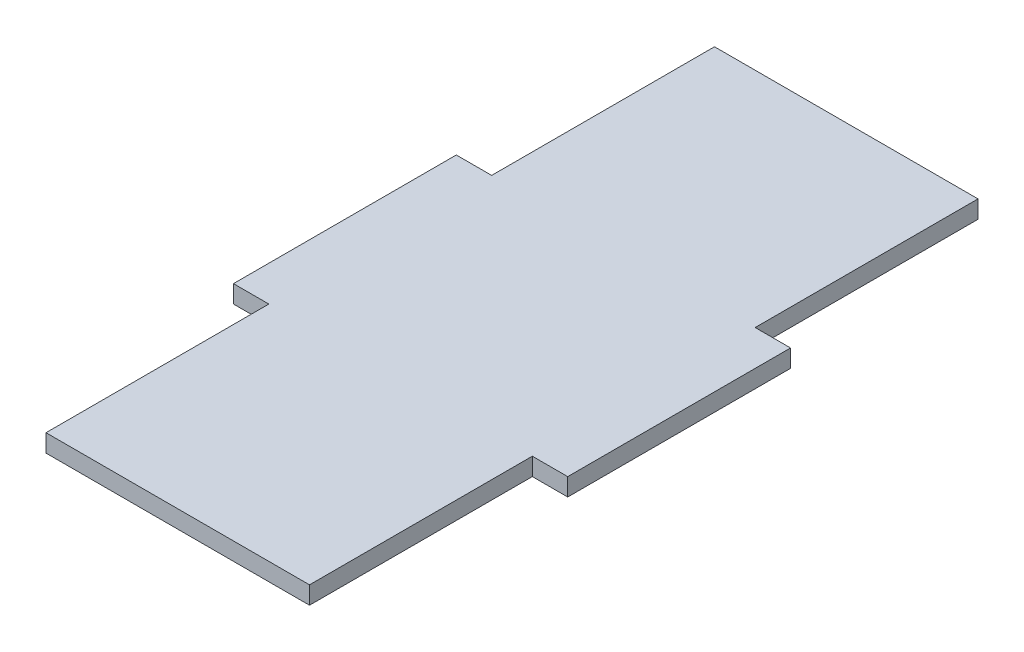
ISO-10303-21;
HEADER;
FILE_DESCRIPTION(('STEP AP214'),'2;1');
FILE_NAME('part.step','',(''),(''),'','','');
FILE_SCHEMA(('AUTOMOTIVE_DESIGN { 1 0 10303 214 1 1 1 1 }'));
ENDSEC;
DATA;
#1=APPLICATION_CONTEXT('core data for automotive mechanical design processes');
#2=APPLICATION_PROTOCOL_DEFINITION('international standard','automotive_design',2000,#1);
#3=PRODUCT_CONTEXT('',#1,'mechanical');
#4=PRODUCT('Part','Part','',(#3));
#5=PRODUCT_RELATED_PRODUCT_CATEGORY('part','',(#4));
#6=PRODUCT_DEFINITION_FORMATION('','',#4);
#7=PRODUCT_DEFINITION_CONTEXT('part definition',#1,'design');
#8=PRODUCT_DEFINITION('design','',#6,#7);
#9=PRODUCT_DEFINITION_SHAPE('','',#8);
#10=(LENGTH_UNIT() NAMED_UNIT(*) SI_UNIT(.MILLI.,.METRE.));
#11=(NAMED_UNIT(*) PLANE_ANGLE_UNIT() SI_UNIT($,.RADIAN.));
#12=(NAMED_UNIT(*) SI_UNIT($,.STERADIAN.) SOLID_ANGLE_UNIT());
#13=UNCERTAINTY_MEASURE_WITH_UNIT(LENGTH_MEASURE(1.E-05),#10,'distance_accuracy_value','');
#14=(GEOMETRIC_REPRESENTATION_CONTEXT(3) GLOBAL_UNCERTAINTY_ASSIGNED_CONTEXT((#13)) GLOBAL_UNIT_ASSIGNED_CONTEXT((#10,
#11,#12)) REPRESENTATION_CONTEXT('',''));
#15=CARTESIAN_POINT('',(0.,0.,0.));
#16=DIRECTION('',(0.,0.,1.));
#17=DIRECTION('',(1.,0.,0.));
#18=AXIS2_PLACEMENT_3D('',#15,#16,#17);
#19=CARTESIAN_POINT('',(30.,3.175,0.));
#20=DIRECTION('',(1.,0.,0.));
#21=DIRECTION('',(0.,0.,-1.));
#22=AXIS2_PLACEMENT_3D('',#19,#20,#21);
#23=PLANE('',#22);
#24=DIRECTION('',(0.,0.,1.));
#25=VECTOR('',#24,1.);
#26=CARTESIAN_POINT('',(30.,0.,0.));
#27=LINE('',#26,#25);
#28=CARTESIAN_POINT('',(30.,0.,-20.));
#29=VERTEX_POINT('',#28);
#30=CARTESIAN_POINT('',(30.,0.,20.));
#31=VERTEX_POINT('',#30);
#32=EDGE_CURVE('E156',#29,#31,#27,.T.);
#33=ORIENTED_EDGE('',*,*,#32,.F.);
#34=DIRECTION('',(0.,-1.,0.));
#35=VECTOR('',#34,1.);
#36=CARTESIAN_POINT('',(30.,3.175,-20.));
#37=LINE('',#36,#35);
#38=CARTESIAN_POINT('',(30.,3.175,-20.));
#39=VERTEX_POINT('',#38);
#40=EDGE_CURVE('E11',#39,#29,#37,.T.);
#41=ORIENTED_EDGE('',*,*,#40,.F.);
#42=DIRECTION('',(0.,0.,1.));
#43=VECTOR('',#42,1.);
#44=CARTESIAN_POINT('',(30.,3.175,0.));
#45=LINE('',#44,#43);
#46=CARTESIAN_POINT('',(30.,3.175,20.));
#47=VERTEX_POINT('',#46);
#48=EDGE_CURVE('E187',#39,#47,#45,.T.);
#49=ORIENTED_EDGE('',*,*,#48,.T.);
#50=DIRECTION('',(0.,-1.,0.));
#51=VECTOR('',#50,1.);
#52=CARTESIAN_POINT('',(30.,3.175,20.));
#53=LINE('',#52,#51);
#54=EDGE_CURVE('E55',#47,#31,#53,.T.);
#55=ORIENTED_EDGE('',*,*,#54,.T.);
#56=EDGE_LOOP('',(#33,#41,#49,#55));
#57=FACE_BOUND('',#56,.T.);
#58=ADVANCED_FACE('F39',(#57),#23,.T.);
#59=CARTESIAN_POINT('',(0.,3.175,-20.));
#60=DIRECTION('',(0.,0.,1.));
#61=DIRECTION('',(1.,0.,0.));
#62=AXIS2_PLACEMENT_3D('',#59,#60,#61);
#63=PLANE('',#62);
#64=DIRECTION('',(-1.,0.,0.));
#65=VECTOR('',#64,1.);
#66=CARTESIAN_POINT('',(0.,0.,-20.));
#67=LINE('',#66,#65);
#68=CARTESIAN_POINT('',(23.65,0.,-20.));
#69=VERTEX_POINT('',#68);
#70=EDGE_CURVE('E158',#29,#69,#67,.T.);
#71=ORIENTED_EDGE('',*,*,#70,.T.);
#72=DIRECTION('',(0.,-1.,0.));
#73=VECTOR('',#72,1.);
#74=CARTESIAN_POINT('',(23.65,3.175,-20.));
#75=LINE('',#74,#73);
#76=CARTESIAN_POINT('',(23.65,3.175,-20.));
#77=VERTEX_POINT('',#76);
#78=EDGE_CURVE('E47',#77,#69,#75,.T.);
#79=ORIENTED_EDGE('',*,*,#78,.F.);
#80=DIRECTION('',(-1.,0.,0.));
#81=VECTOR('',#80,1.);
#82=CARTESIAN_POINT('',(0.,3.175,-20.));
#83=LINE('',#82,#81);
#84=EDGE_CURVE('E223',#39,#77,#83,.T.);
#85=ORIENTED_EDGE('',*,*,#84,.F.);
#86=ORIENTED_EDGE('',*,*,#40,.T.);
#87=EDGE_LOOP('',(#71,#79,#85,#86));
#88=FACE_BOUND('',#87,.T.);
#89=ADVANCED_FACE('F212',(#88),#63,.F.);
#90=CARTESIAN_POINT('',(23.65,3.175,0.));
#91=DIRECTION('',(1.,0.,0.));
#92=DIRECTION('',(0.,0.,-1.));
#93=AXIS2_PLACEMENT_3D('',#90,#91,#92);
#94=PLANE('',#93);
#95=DIRECTION('',(0.,0.,1.));
#96=VECTOR('',#95,1.);
#97=CARTESIAN_POINT('',(23.65,0.,0.));
#98=LINE('',#97,#96);
#99=CARTESIAN_POINT('',(23.65,0.,-60.));
#100=VERTEX_POINT('',#99);
#101=EDGE_CURVE('E161',#100,#69,#98,.T.);
#102=ORIENTED_EDGE('',*,*,#101,.F.);
#103=DIRECTION('',(0.,-1.,0.));
#104=VECTOR('',#103,1.);
#105=CARTESIAN_POINT('',(23.65,3.175,-60.));
#106=LINE('',#105,#104);
#107=CARTESIAN_POINT('',(23.65,3.175,-60.));
#108=VERTEX_POINT('',#107);
#109=EDGE_CURVE('E202',#108,#100,#106,.T.);
#110=ORIENTED_EDGE('',*,*,#109,.F.);
#111=DIRECTION('',(0.,0.,1.));
#112=VECTOR('',#111,1.);
#113=CARTESIAN_POINT('',(23.65,3.175,0.));
#114=LINE('',#113,#112);
#115=EDGE_CURVE('E209',#108,#77,#114,.T.);
#116=ORIENTED_EDGE('',*,*,#115,.T.);
#117=ORIENTED_EDGE('',*,*,#78,.T.);
#118=EDGE_LOOP('',(#102,#110,#116,#117));
#119=FACE_BOUND('',#118,.T.);
#120=ADVANCED_FACE('F207',(#119),#94,.T.);
#121=CARTESIAN_POINT('',(0.,3.175,-60.));
#122=DIRECTION('',(0.,0.,-1.));
#123=DIRECTION('',(-1.,0.,0.));
#124=AXIS2_PLACEMENT_3D('',#121,#122,#123);
#125=PLANE('',#124);
#126=DIRECTION('',(1.,0.,0.));
#127=VECTOR('',#126,1.);
#128=CARTESIAN_POINT('',(0.,0.,-60.));
#129=LINE('',#128,#127);
#130=CARTESIAN_POINT('',(-23.65,0.,-60.));
#131=VERTEX_POINT('',#130);
#132=EDGE_CURVE('E164',#131,#100,#129,.T.);
#133=ORIENTED_EDGE('',*,*,#132,.F.);
#134=DIRECTION('',(0.,-1.,0.));
#135=VECTOR('',#134,1.);
#136=CARTESIAN_POINT('',(-23.65,3.175,-60.));
#137=LINE('',#136,#135);
#138=CARTESIAN_POINT('',(-23.65,3.175,-60.));
#139=VERTEX_POINT('',#138);
#140=EDGE_CURVE('E200',#139,#131,#137,.T.);
#141=ORIENTED_EDGE('',*,*,#140,.F.);
#142=DIRECTION('',(1.,0.,0.));
#143=VECTOR('',#142,1.);
#144=CARTESIAN_POINT('',(0.,3.175,-60.));
#145=LINE('',#144,#143);
#146=EDGE_CURVE('E222',#139,#108,#145,.T.);
#147=ORIENTED_EDGE('',*,*,#146,.T.);
#148=ORIENTED_EDGE('',*,*,#109,.T.);
#149=EDGE_LOOP('',(#133,#141,#147,#148));
#150=FACE_BOUND('',#149,.T.);
#151=ADVANCED_FACE('F218',(#150),#125,.T.);
#152=CARTESIAN_POINT('',(-23.65,3.175,0.));
#153=DIRECTION('',(1.,0.,0.));
#154=DIRECTION('',(0.,0.,-1.));
#155=AXIS2_PLACEMENT_3D('',#152,#153,#154);
#156=PLANE('',#155);
#157=DIRECTION('',(0.,0.,1.));
#158=VECTOR('',#157,1.);
#159=CARTESIAN_POINT('',(-23.65,0.,0.));
#160=LINE('',#159,#158);
#161=CARTESIAN_POINT('',(-23.65,0.,-20.));
#162=VERTEX_POINT('',#161);
#163=EDGE_CURVE('E167',#131,#162,#160,.T.);
#164=ORIENTED_EDGE('',*,*,#163,.T.);
#165=DIRECTION('',(0.,-1.,0.));
#166=VECTOR('',#165,1.);
#167=CARTESIAN_POINT('',(-23.65,3.175,-20.));
#168=LINE('',#167,#166);
#169=CARTESIAN_POINT('',(-23.65,3.175,-20.));
#170=VERTEX_POINT('',#169);
#171=EDGE_CURVE('E198',#170,#162,#168,.T.);
#172=ORIENTED_EDGE('',*,*,#171,.F.);
#173=DIRECTION('',(0.,0.,1.));
#174=VECTOR('',#173,1.);
#175=CARTESIAN_POINT('',(-23.65,3.175,0.));
#176=LINE('',#175,#174);
#177=EDGE_CURVE('E225',#139,#170,#176,.T.);
#178=ORIENTED_EDGE('',*,*,#177,.F.);
#179=ORIENTED_EDGE('',*,*,#140,.T.);
#180=EDGE_LOOP('',(#164,#172,#178,#179));
#181=FACE_BOUND('',#180,.T.);
#182=ADVANCED_FACE('F263',(#181),#156,.F.);
#183=CARTESIAN_POINT('',(0.,3.175,-20.));
#184=DIRECTION('',(0.,0.,-1.));
#185=DIRECTION('',(-1.,0.,0.));
#186=AXIS2_PLACEMENT_3D('',#183,#184,#185);
#187=PLANE('',#186);
#188=DIRECTION('',(1.,0.,0.));
#189=VECTOR('',#188,1.);
#190=CARTESIAN_POINT('',(0.,0.,-20.));
#191=LINE('',#190,#189);
#192=CARTESIAN_POINT('',(-30.,0.,-20.));
#193=VERTEX_POINT('',#192);
#194=EDGE_CURVE('E170',#193,#162,#191,.T.);
#195=ORIENTED_EDGE('',*,*,#194,.F.);
#196=DIRECTION('',(0.,-1.,0.));
#197=VECTOR('',#196,1.);
#198=CARTESIAN_POINT('',(-30.,3.175,-20.));
#199=LINE('',#198,#197);
#200=CARTESIAN_POINT('',(-30.,3.175,-20.));
#201=VERTEX_POINT('',#200);
#202=EDGE_CURVE('E196',#201,#193,#199,.T.);
#203=ORIENTED_EDGE('',*,*,#202,.F.);
#204=DIRECTION('',(1.,0.,0.));
#205=VECTOR('',#204,1.);
#206=CARTESIAN_POINT('',(0.,3.175,-20.));
#207=LINE('',#206,#205);
#208=EDGE_CURVE('E231',#201,#170,#207,.T.);
#209=ORIENTED_EDGE('',*,*,#208,.T.);
#210=ORIENTED_EDGE('',*,*,#171,.T.);
#211=EDGE_LOOP('',(#195,#203,#209,#210));
#212=FACE_BOUND('',#211,.T.);
#213=ADVANCED_FACE('F266',(#212),#187,.T.);
#214=CARTESIAN_POINT('',(-30.,3.175,0.));
#215=DIRECTION('',(1.,0.,0.));
#216=DIRECTION('',(0.,0.,-1.));
#217=AXIS2_PLACEMENT_3D('',#214,#215,#216);
#218=PLANE('',#217);
#219=DIRECTION('',(0.,0.,1.));
#220=VECTOR('',#219,1.);
#221=CARTESIAN_POINT('',(-30.,0.,0.));
#222=LINE('',#221,#220);
#223=CARTESIAN_POINT('',(-30.,0.,20.));
#224=VERTEX_POINT('',#223);
#225=EDGE_CURVE('E173',#193,#224,#222,.T.);
#226=ORIENTED_EDGE('',*,*,#225,.T.);
#227=DIRECTION('',(0.,-1.,0.));
#228=VECTOR('',#227,1.);
#229=CARTESIAN_POINT('',(-30.,3.175,20.));
#230=LINE('',#229,#228);
#231=CARTESIAN_POINT('',(-30.,3.175,20.));
#232=VERTEX_POINT('',#231);
#233=EDGE_CURVE('E193',#232,#224,#230,.T.);
#234=ORIENTED_EDGE('',*,*,#233,.F.);
#235=DIRECTION('',(0.,0.,1.));
#236=VECTOR('',#235,1.);
#237=CARTESIAN_POINT('',(-30.,3.175,0.));
#238=LINE('',#237,#236);
#239=EDGE_CURVE('E234',#201,#232,#238,.T.);
#240=ORIENTED_EDGE('',*,*,#239,.F.);
#241=ORIENTED_EDGE('',*,*,#202,.T.);
#242=EDGE_LOOP('',(#226,#234,#240,#241));
#243=FACE_BOUND('',#242,.T.);
#244=ADVANCED_FACE('F270',(#243),#218,.F.);
#245=CARTESIAN_POINT('',(0.,3.175,20.));
#246=DIRECTION('',(0.,0.,-1.));
#247=DIRECTION('',(-1.,0.,0.));
#248=AXIS2_PLACEMENT_3D('',#245,#246,#247);
#249=PLANE('',#248);
#250=DIRECTION('',(1.,0.,0.));
#251=VECTOR('',#250,1.);
#252=CARTESIAN_POINT('',(0.,0.,20.));
#253=LINE('',#252,#251);
#254=CARTESIAN_POINT('',(-23.65,0.,20.));
#255=VERTEX_POINT('',#254);
#256=EDGE_CURVE('E175',#224,#255,#253,.T.);
#257=ORIENTED_EDGE('',*,*,#256,.T.);
#258=DIRECTION('',(0.,-1.,0.));
#259=VECTOR('',#258,1.);
#260=CARTESIAN_POINT('',(-23.65,3.175,20.));
#261=LINE('',#260,#259);
#262=CARTESIAN_POINT('',(-23.65,3.175,20.));
#263=VERTEX_POINT('',#262);
#264=EDGE_CURVE('E191',#263,#255,#261,.T.);
#265=ORIENTED_EDGE('',*,*,#264,.F.);
#266=DIRECTION('',(1.,0.,0.));
#267=VECTOR('',#266,1.);
#268=CARTESIAN_POINT('',(0.,3.175,20.));
#269=LINE('',#268,#267);
#270=EDGE_CURVE('E236',#232,#263,#269,.T.);
#271=ORIENTED_EDGE('',*,*,#270,.F.);
#272=ORIENTED_EDGE('',*,*,#233,.T.);
#273=EDGE_LOOP('',(#257,#265,#271,#272));
#274=FACE_BOUND('',#273,.T.);
#275=ADVANCED_FACE('F274',(#274),#249,.F.);
#276=CARTESIAN_POINT('',(-23.65,3.175,0.));
#277=DIRECTION('',(-1.,0.,0.));
#278=DIRECTION('',(0.,0.,1.));
#279=AXIS2_PLACEMENT_3D('',#276,#277,#278);
#280=PLANE('',#279);
#281=DIRECTION('',(0.,0.,-1.));
#282=VECTOR('',#281,1.);
#283=CARTESIAN_POINT('',(-23.65,0.,0.));
#284=LINE('',#283,#282);
#285=CARTESIAN_POINT('',(-23.65,0.,60.));
#286=VERTEX_POINT('',#285);
#287=EDGE_CURVE('E178',#286,#255,#284,.T.);
#288=ORIENTED_EDGE('',*,*,#287,.F.);
#289=DIRECTION('',(0.,-1.,0.));
#290=VECTOR('',#289,1.);
#291=CARTESIAN_POINT('',(-23.65,3.175,60.));
#292=LINE('',#291,#290);
#293=CARTESIAN_POINT('',(-23.65,3.175,60.));
#294=VERTEX_POINT('',#293);
#295=EDGE_CURVE('E148',#294,#286,#292,.T.);
#296=ORIENTED_EDGE('',*,*,#295,.F.);
#297=DIRECTION('',(0.,0.,-1.));
#298=VECTOR('',#297,1.);
#299=CARTESIAN_POINT('',(-23.65,3.175,0.));
#300=LINE('',#299,#298);
#301=EDGE_CURVE('E138',#294,#263,#300,.T.);
#302=ORIENTED_EDGE('',*,*,#301,.T.);
#303=ORIENTED_EDGE('',*,*,#264,.T.);
#304=EDGE_LOOP('',(#288,#296,#302,#303));
#305=FACE_BOUND('',#304,.T.);
#306=ADVANCED_FACE('F239',(#305),#280,.T.);
#307=CARTESIAN_POINT('',(0.,3.175,60.));
#308=DIRECTION('',(0.,0.,-1.));
#309=DIRECTION('',(-1.,0.,0.));
#310=AXIS2_PLACEMENT_3D('',#307,#308,#309);
#311=PLANE('',#310);
#312=DIRECTION('',(1.,0.,0.));
#313=VECTOR('',#312,1.);
#314=CARTESIAN_POINT('',(0.,0.,60.));
#315=LINE('',#314,#313);
#316=CARTESIAN_POINT('',(23.65,0.,60.));
#317=VERTEX_POINT('',#316);
#318=EDGE_CURVE('E145',#286,#317,#315,.T.);
#319=ORIENTED_EDGE('',*,*,#318,.T.);
#320=DIRECTION('',(0.,-1.,0.));
#321=VECTOR('',#320,1.);
#322=CARTESIAN_POINT('',(23.65,3.175,60.));
#323=LINE('',#322,#321);
#324=CARTESIAN_POINT('',(23.65,3.175,60.));
#325=VERTEX_POINT('',#324);
#326=EDGE_CURVE('E142',#325,#317,#323,.T.);
#327=ORIENTED_EDGE('',*,*,#326,.F.);
#328=DIRECTION('',(1.,0.,0.));
#329=VECTOR('',#328,1.);
#330=CARTESIAN_POINT('',(0.,3.175,60.));
#331=LINE('',#330,#329);
#332=EDGE_CURVE('E130',#294,#325,#331,.T.);
#333=ORIENTED_EDGE('',*,*,#332,.F.);
#334=ORIENTED_EDGE('',*,*,#295,.T.);
#335=EDGE_LOOP('',(#319,#327,#333,#334));
#336=FACE_BOUND('',#335,.T.);
#337=ADVANCED_FACE('F143',(#336),#311,.F.);
#338=CARTESIAN_POINT('',(23.65,3.175,0.));
#339=DIRECTION('',(-1.,0.,0.));
#340=DIRECTION('',(0.,0.,1.));
#341=AXIS2_PLACEMENT_3D('',#338,#339,#340);
#342=PLANE('',#341);
#343=DIRECTION('',(0.,0.,-1.));
#344=VECTOR('',#343,1.);
#345=CARTESIAN_POINT('',(23.65,0.,0.));
#346=LINE('',#345,#344);
#347=CARTESIAN_POINT('',(23.65,0.,20.));
#348=VERTEX_POINT('',#347);
#349=EDGE_CURVE('E182',#317,#348,#346,.T.);
#350=ORIENTED_EDGE('',*,*,#349,.T.);
#351=DIRECTION('',(0.,-1.,0.));
#352=VECTOR('',#351,1.);
#353=CARTESIAN_POINT('',(23.65,3.175,20.));
#354=LINE('',#353,#352);
#355=CARTESIAN_POINT('',(23.65,3.175,20.));
#356=VERTEX_POINT('',#355);
#357=EDGE_CURVE('E93',#356,#348,#354,.T.);
#358=ORIENTED_EDGE('',*,*,#357,.F.);
#359=DIRECTION('',(0.,0.,-1.));
#360=VECTOR('',#359,1.);
#361=CARTESIAN_POINT('',(23.65,3.175,0.));
#362=LINE('',#361,#360);
#363=EDGE_CURVE('E136',#325,#356,#362,.T.);
#364=ORIENTED_EDGE('',*,*,#363,.F.);
#365=ORIENTED_EDGE('',*,*,#326,.T.);
#366=EDGE_LOOP('',(#350,#358,#364,#365));
#367=FACE_BOUND('',#366,.T.);
#368=ADVANCED_FACE('F150',(#367),#342,.F.);
#369=CARTESIAN_POINT('',(0.,3.175,20.));
#370=DIRECTION('',(0.,0.,1.));
#371=DIRECTION('',(1.,0.,0.));
#372=AXIS2_PLACEMENT_3D('',#369,#370,#371);
#373=PLANE('',#372);
#374=DIRECTION('',(-1.,0.,0.));
#375=VECTOR('',#374,1.);
#376=CARTESIAN_POINT('',(0.,0.,20.));
#377=LINE('',#376,#375);
#378=EDGE_CURVE('E184',#31,#348,#377,.T.);
#379=ORIENTED_EDGE('',*,*,#378,.F.);
#380=ORIENTED_EDGE('',*,*,#54,.F.);
#381=DIRECTION('',(-1.,0.,0.));
#382=VECTOR('',#381,1.);
#383=CARTESIAN_POINT('',(0.,3.175,20.));
#384=LINE('',#383,#382);
#385=EDGE_CURVE('E151',#47,#356,#384,.T.);
#386=ORIENTED_EDGE('',*,*,#385,.T.);
#387=ORIENTED_EDGE('',*,*,#357,.T.);
#388=EDGE_LOOP('',(#379,#380,#386,#387));
#389=FACE_BOUND('',#388,.T.);
#390=ADVANCED_FACE('F242',(#389),#373,.T.);
#391=CARTESIAN_POINT('',(0.,3.175,0.));
#392=DIRECTION('',(0.,1.,0.));
#393=DIRECTION('',(0.,0.,1.));
#394=AXIS2_PLACEMENT_3D('',#391,#392,#393);
#395=PLANE('',#394);
#396=ORIENTED_EDGE('',*,*,#48,.F.);
#397=ORIENTED_EDGE('',*,*,#84,.T.);
#398=ORIENTED_EDGE('',*,*,#115,.F.);
#399=ORIENTED_EDGE('',*,*,#146,.F.);
#400=ORIENTED_EDGE('',*,*,#177,.T.);
#401=ORIENTED_EDGE('',*,*,#208,.F.);
#402=ORIENTED_EDGE('',*,*,#239,.T.);
#403=ORIENTED_EDGE('',*,*,#270,.T.);
#404=ORIENTED_EDGE('',*,*,#301,.F.);
#405=ORIENTED_EDGE('',*,*,#332,.T.);
#406=ORIENTED_EDGE('',*,*,#363,.T.);
#407=ORIENTED_EDGE('',*,*,#385,.F.);
#408=EDGE_LOOP('',(#396,#397,#398,#399,#400,#401,#402,#403,#404,#405,#406,#407));
#409=FACE_BOUND('',#408,.T.);
#410=ADVANCED_FACE('F133',(#409),#395,.T.);
#411=CARTESIAN_POINT('',(0.,0.,0.));
#412=DIRECTION('',(0.,1.,0.));
#413=DIRECTION('',(0.,0.,1.));
#414=AXIS2_PLACEMENT_3D('',#411,#412,#413);
#415=PLANE('',#414);
#416=ORIENTED_EDGE('',*,*,#32,.T.);
#417=ORIENTED_EDGE('',*,*,#378,.T.);
#418=ORIENTED_EDGE('',*,*,#349,.F.);
#419=ORIENTED_EDGE('',*,*,#318,.F.);
#420=ORIENTED_EDGE('',*,*,#287,.T.);
#421=ORIENTED_EDGE('',*,*,#256,.F.);
#422=ORIENTED_EDGE('',*,*,#225,.F.);
#423=ORIENTED_EDGE('',*,*,#194,.T.);
#424=ORIENTED_EDGE('',*,*,#163,.F.);
#425=ORIENTED_EDGE('',*,*,#132,.T.);
#426=ORIENTED_EDGE('',*,*,#101,.T.);
#427=ORIENTED_EDGE('',*,*,#70,.F.);
#428=EDGE_LOOP('',(#416,#417,#418,#419,#420,#421,#422,#423,#424,#425,#426,#427));
#429=FACE_BOUND('',#428,.T.);
#430=ADVANCED_FACE('F214',(#429),#415,.F.);
#431=CLOSED_SHELL('',(#58,#89,#120,#151,#182,#213,#244,#275,#306,#337,#368,#390,#410,#430));
#432=MANIFOLD_SOLID_BREP('B2',#431);
#433=ADVANCED_BREP_SHAPE_REPRESENTATION('',(#18,#432),#14);
#434=SHAPE_DEFINITION_REPRESENTATION(#9,#433);
ENDSEC;
END-ISO-10303-21;
